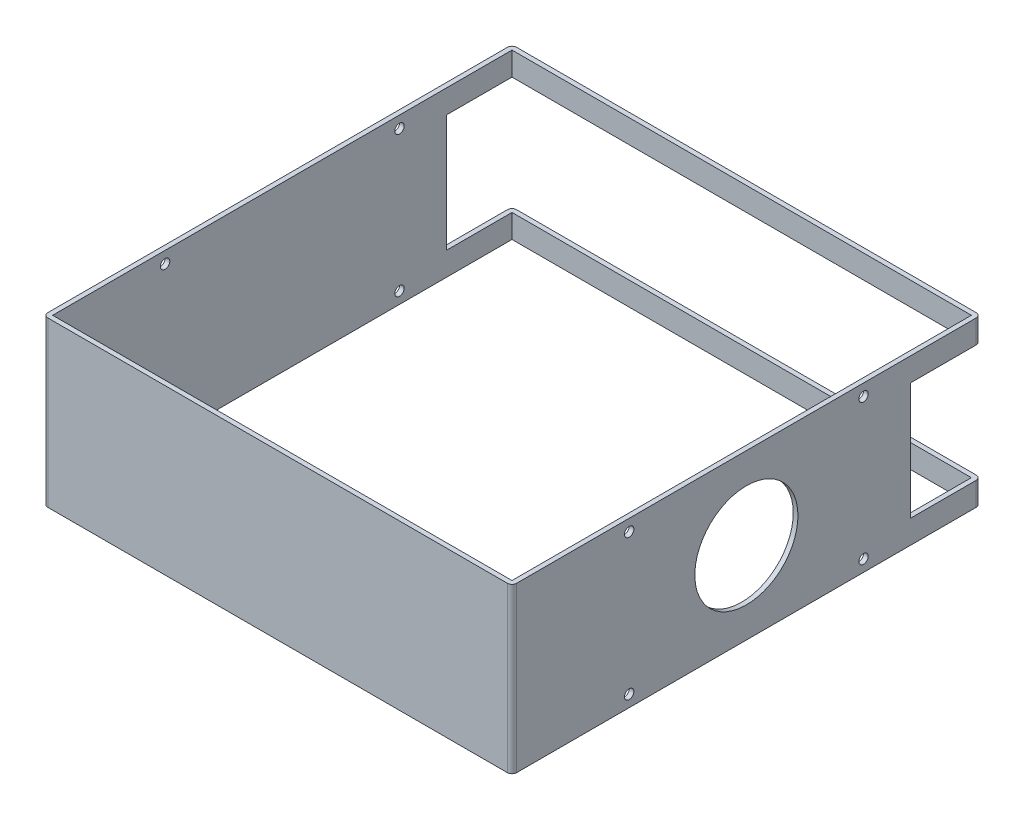
ISO-10303-21;
HEADER;
FILE_DESCRIPTION(('STEP AP214'),'2;1');
FILE_NAME('part.step','',(''),(''),'','','');
FILE_SCHEMA(('AUTOMOTIVE_DESIGN { 1 0 10303 214 1 1 1 1 }'));
ENDSEC;
DATA;
#1=APPLICATION_CONTEXT('core data for automotive mechanical design processes');
#2=APPLICATION_PROTOCOL_DEFINITION('international standard','automotive_design',2000,#1);
#3=PRODUCT_CONTEXT('',#1,'mechanical');
#4=PRODUCT('Part','Part','',(#3));
#5=PRODUCT_RELATED_PRODUCT_CATEGORY('part','',(#4));
#6=PRODUCT_DEFINITION_FORMATION('','',#4);
#7=PRODUCT_DEFINITION_CONTEXT('part definition',#1,'design');
#8=PRODUCT_DEFINITION('design','',#6,#7);
#9=PRODUCT_DEFINITION_SHAPE('','',#8);
#10=(LENGTH_UNIT() NAMED_UNIT(*) SI_UNIT(.MILLI.,.METRE.));
#11=(NAMED_UNIT(*) PLANE_ANGLE_UNIT() SI_UNIT($,.RADIAN.));
#12=(NAMED_UNIT(*) SI_UNIT($,.STERADIAN.) SOLID_ANGLE_UNIT());
#13=UNCERTAINTY_MEASURE_WITH_UNIT(LENGTH_MEASURE(1.E-05),#10,'distance_accuracy_value','');
#14=(GEOMETRIC_REPRESENTATION_CONTEXT(3) GLOBAL_UNCERTAINTY_ASSIGNED_CONTEXT((#13)) GLOBAL_UNIT_ASSIGNED_CONTEXT((#10,
#11,#12)) REPRESENTATION_CONTEXT('',''));
#15=CARTESIAN_POINT('',(0.,0.,0.));
#16=DIRECTION('',(0.,0.,1.));
#17=DIRECTION('',(1.,0.,0.));
#18=AXIS2_PLACEMENT_3D('',#15,#16,#17);
#19=CARTESIAN_POINT('',(50.,35.,-50.));
#20=DIRECTION('',(-1.,0.,0.));
#21=DIRECTION('',(0.,0.,1.));
#22=AXIS2_PLACEMENT_3D('',#19,#20,#21);
#23=PLANE('',#22);
#24=CARTESIAN_POINT('',(50.,17.5,0.));
#25=DIRECTION('',(1.,0.,0.));
#26=DIRECTION('',(0.,0.,-1.));
#27=AXIS2_PLACEMENT_3D('',#24,#25,#26);
#28=CIRCLE('',#27,11.);
#29=CARTESIAN_POINT('',(50.,17.5,-11.));
#30=VERTEX_POINT('',#29);
#31=EDGE_CURVE('E361',#30,#30,#28,.T.);
#32=ORIENTED_EDGE('',*,*,#31,.F.);
#33=EDGE_LOOP('',(#32));
#34=FACE_BOUND('',#33,.T.);
#35=CARTESIAN_POINT('',(50.,2.50000000000002,25.));
#36=DIRECTION('',(-1.,0.,0.));
#37=DIRECTION('',(0.,0.,1.));
#38=AXIS2_PLACEMENT_3D('',#35,#36,#37);
#39=CIRCLE('',#38,1.);
#40=CARTESIAN_POINT('',(50.,2.50000000000002,26.));
#41=VERTEX_POINT('',#40);
#42=EDGE_CURVE('E349',#41,#41,#39,.T.);
#43=ORIENTED_EDGE('',*,*,#42,.T.);
#44=EDGE_LOOP('',(#43));
#45=FACE_BOUND('',#44,.T.);
#46=CARTESIAN_POINT('',(50.,32.5,-25.));
#47=DIRECTION('',(-1.,0.,0.));
#48=DIRECTION('',(0.,0.,1.));
#49=AXIS2_PLACEMENT_3D('',#46,#47,#48);
#50=CIRCLE('',#49,1.);
#51=CARTESIAN_POINT('',(50.,32.5,-24.));
#52=VERTEX_POINT('',#51);
#53=EDGE_CURVE('E343',#52,#52,#50,.T.);
#54=ORIENTED_EDGE('',*,*,#53,.T.);
#55=EDGE_LOOP('',(#54));
#56=FACE_BOUND('',#55,.T.);
#57=DIRECTION('',(0.,0.,-1.));
#58=VECTOR('',#57,1.);
#59=CARTESIAN_POINT('',(50.,0.,-50.));
#60=LINE('',#59,#58);
#61=CARTESIAN_POINT('',(50.,0.,49.));
#62=VERTEX_POINT('',#61);
#63=CARTESIAN_POINT('',(50.,0.,-49.));
#64=VERTEX_POINT('',#63);
#65=EDGE_CURVE('E279',#62,#64,#60,.T.);
#66=ORIENTED_EDGE('',*,*,#65,.T.);
#67=DIRECTION('',(0.,-1.,0.));
#68=VECTOR('',#67,1.);
#69=CARTESIAN_POINT('',(50.,35.,-49.));
#70=LINE('',#69,#68);
#71=CARTESIAN_POINT('',(50.,5.,-49.));
#72=VERTEX_POINT('',#71);
#73=EDGE_CURVE('E11',#64,#72,#70,.F.);
#74=ORIENTED_EDGE('',*,*,#73,.T.);
#75=DIRECTION('',(0.,0.,-1.));
#76=VECTOR('',#75,1.);
#77=CARTESIAN_POINT('',(50.,5.,-35.));
#78=LINE('',#77,#76);
#79=CARTESIAN_POINT('',(50.,5.,-35.));
#80=VERTEX_POINT('',#79);
#81=EDGE_CURVE('E194',#80,#72,#78,.T.);
#82=ORIENTED_EDGE('',*,*,#81,.F.);
#83=DIRECTION('',(0.,-1.,0.));
#84=VECTOR('',#83,1.);
#85=CARTESIAN_POINT('',(50.,0.,-35.));
#86=LINE('',#85,#84);
#87=CARTESIAN_POINT('',(50.,30.,-35.));
#88=VERTEX_POINT('',#87);
#89=EDGE_CURVE('E206',#88,#80,#86,.T.);
#90=ORIENTED_EDGE('',*,*,#89,.F.);
#91=DIRECTION('',(0.,0.,-1.));
#92=VECTOR('',#91,1.);
#93=CARTESIAN_POINT('',(50.,30.,-35.));
#94=LINE('',#93,#92);
#95=CARTESIAN_POINT('',(50.,30.,-49.));
#96=VERTEX_POINT('',#95);
#97=EDGE_CURVE('E231',#88,#96,#94,.T.);
#98=ORIENTED_EDGE('',*,*,#97,.T.);
#99=DIRECTION('',(0.,-1.,0.));
#100=VECTOR('',#99,1.);
#101=CARTESIAN_POINT('',(50.,35.,-49.));
#102=LINE('',#101,#100);
#103=CARTESIAN_POINT('',(50.,35.,-49.));
#104=VERTEX_POINT('',#103);
#105=EDGE_CURVE('E49',#96,#104,#102,.F.);
#106=ORIENTED_EDGE('',*,*,#105,.T.);
#107=DIRECTION('',(0.,0.,-1.));
#108=VECTOR('',#107,1.);
#109=CARTESIAN_POINT('',(50.,35.,-50.));
#110=LINE('',#109,#108);
#111=CARTESIAN_POINT('',(50.,35.,49.));
#112=VERTEX_POINT('',#111);
#113=EDGE_CURVE('E292',#112,#104,#110,.T.);
#114=ORIENTED_EDGE('',*,*,#113,.F.);
#115=DIRECTION('',(0.,-1.,0.));
#116=VECTOR('',#115,1.);
#117=CARTESIAN_POINT('',(50.,35.,49.));
#118=LINE('',#117,#116);
#119=EDGE_CURVE('E428',#112,#62,#118,.T.);
#120=ORIENTED_EDGE('',*,*,#119,.T.);
#121=EDGE_LOOP('',(#66,#74,#82,#90,#98,#106,#114,#120));
#122=FACE_BOUND('',#121,.T.);
#123=CARTESIAN_POINT('',(50.,2.50000000000002,-25.));
#124=DIRECTION('',(-1.,0.,0.));
#125=DIRECTION('',(0.,0.,1.));
#126=AXIS2_PLACEMENT_3D('',#123,#124,#125);
#127=CIRCLE('',#126,1.);
#128=CARTESIAN_POINT('',(50.,2.50000000000002,-24.));
#129=VERTEX_POINT('',#128);
#130=EDGE_CURVE('E355',#129,#129,#127,.F.);
#131=ORIENTED_EDGE('',*,*,#130,.F.);
#132=EDGE_LOOP('',(#131));
#133=FACE_BOUND('',#132,.T.);
#134=CARTESIAN_POINT('',(50.,32.5,25.));
#135=DIRECTION('',(-1.,0.,0.));
#136=DIRECTION('',(0.,0.,1.));
#137=AXIS2_PLACEMENT_3D('',#134,#135,#136);
#138=CIRCLE('',#137,1.);
#139=CARTESIAN_POINT('',(50.,32.5,26.));
#140=VERTEX_POINT('',#139);
#141=EDGE_CURVE('E455',#140,#140,#138,.F.);
#142=ORIENTED_EDGE('',*,*,#141,.F.);
#143=EDGE_LOOP('',(#142));
#144=FACE_BOUND('',#143,.T.);
#145=ADVANCED_FACE('F40',(#34,#45,#56,#122,#133,#144),#23,.F.);
#146=CARTESIAN_POINT('',(-50.,35.,-50.));
#147=DIRECTION('',(1.,0.,0.));
#148=DIRECTION('',(0.,0.,-1.));
#149=AXIS2_PLACEMENT_3D('',#146,#147,#148);
#150=PLANE('',#149);
#151=CARTESIAN_POINT('',(-50.,2.50000000000002,25.));
#152=DIRECTION('',(-1.,0.,0.));
#153=DIRECTION('',(0.,0.,1.));
#154=AXIS2_PLACEMENT_3D('',#151,#152,#153);
#155=CIRCLE('',#154,1.);
#156=CARTESIAN_POINT('',(-50.,2.50000000000002,26.));
#157=VERTEX_POINT('',#156);
#158=EDGE_CURVE('E360',#157,#157,#155,.T.);
#159=ORIENTED_EDGE('',*,*,#158,.F.);
#160=EDGE_LOOP('',(#159));
#161=FACE_BOUND('',#160,.T.);
#162=CARTESIAN_POINT('',(-50.,32.5,-25.));
#163=DIRECTION('',(-1.,0.,0.));
#164=DIRECTION('',(0.,0.,1.));
#165=AXIS2_PLACEMENT_3D('',#162,#163,#164);
#166=CIRCLE('',#165,1.);
#167=CARTESIAN_POINT('',(-50.,32.5,-24.));
#168=VERTEX_POINT('',#167);
#169=EDGE_CURVE('E337',#168,#168,#166,.T.);
#170=ORIENTED_EDGE('',*,*,#169,.F.);
#171=EDGE_LOOP('',(#170));
#172=FACE_BOUND('',#171,.T.);
#173=DIRECTION('',(0.,0.,1.));
#174=VECTOR('',#173,1.);
#175=CARTESIAN_POINT('',(-50.,0.,-50.));
#176=LINE('',#175,#174);
#177=CARTESIAN_POINT('',(-50.,0.,-49.));
#178=VERTEX_POINT('',#177);
#179=CARTESIAN_POINT('',(-50.,0.,49.));
#180=VERTEX_POINT('',#179);
#181=EDGE_CURVE('E315',#178,#180,#176,.T.);
#182=ORIENTED_EDGE('',*,*,#181,.T.);
#183=DIRECTION('',(0.,-1.,0.));
#184=VECTOR('',#183,1.);
#185=CARTESIAN_POINT('',(-50.,35.,49.));
#186=LINE('',#185,#184);
#187=CARTESIAN_POINT('',(-50.,35.,49.));
#188=VERTEX_POINT('',#187);
#189=EDGE_CURVE('E388',#180,#188,#186,.F.);
#190=ORIENTED_EDGE('',*,*,#189,.T.);
#191=DIRECTION('',(0.,0.,1.));
#192=VECTOR('',#191,1.);
#193=CARTESIAN_POINT('',(-50.,35.,-50.));
#194=LINE('',#193,#192);
#195=CARTESIAN_POINT('',(-50.,35.,-49.));
#196=VERTEX_POINT('',#195);
#197=EDGE_CURVE('E301',#196,#188,#194,.T.);
#198=ORIENTED_EDGE('',*,*,#197,.F.);
#199=DIRECTION('',(0.,-1.,0.));
#200=VECTOR('',#199,1.);
#201=CARTESIAN_POINT('',(-50.,35.,-49.));
#202=LINE('',#201,#200);
#203=CARTESIAN_POINT('',(-50.,30.,-49.));
#204=VERTEX_POINT('',#203);
#205=EDGE_CURVE('E384',#196,#204,#202,.T.);
#206=ORIENTED_EDGE('',*,*,#205,.T.);
#207=DIRECTION('',(0.,0.,-1.));
#208=VECTOR('',#207,1.);
#209=CARTESIAN_POINT('',(-50.,30.,-35.));
#210=LINE('',#209,#208);
#211=CARTESIAN_POINT('',(-50.,30.,-35.));
#212=VERTEX_POINT('',#211);
#213=EDGE_CURVE('E221',#212,#204,#210,.T.);
#214=ORIENTED_EDGE('',*,*,#213,.F.);
#215=DIRECTION('',(0.,-1.,0.));
#216=VECTOR('',#215,1.);
#217=CARTESIAN_POINT('',(-50.,0.,-35.));
#218=LINE('',#217,#216);
#219=CARTESIAN_POINT('',(-50.,5.,-35.));
#220=VERTEX_POINT('',#219);
#221=EDGE_CURVE('E201',#212,#220,#218,.T.);
#222=ORIENTED_EDGE('',*,*,#221,.T.);
#223=DIRECTION('',(0.,0.,-1.));
#224=VECTOR('',#223,1.);
#225=CARTESIAN_POINT('',(-50.,5.,-35.));
#226=LINE('',#225,#224);
#227=CARTESIAN_POINT('',(-50.,5.,-49.));
#228=VERTEX_POINT('',#227);
#229=EDGE_CURVE('E216',#220,#228,#226,.T.);
#230=ORIENTED_EDGE('',*,*,#229,.T.);
#231=DIRECTION('',(0.,-1.,0.));
#232=VECTOR('',#231,1.);
#233=CARTESIAN_POINT('',(-50.,35.,-49.));
#234=LINE('',#233,#232);
#235=EDGE_CURVE('E380',#228,#178,#234,.T.);
#236=ORIENTED_EDGE('',*,*,#235,.T.);
#237=EDGE_LOOP('',(#182,#190,#198,#206,#214,#222,#230,#236));
#238=FACE_BOUND('',#237,.T.);
#239=CARTESIAN_POINT('',(-50.,2.50000000000002,-25.));
#240=DIRECTION('',(-1.,0.,0.));
#241=DIRECTION('',(0.,0.,1.));
#242=AXIS2_PLACEMENT_3D('',#239,#240,#241);
#243=CIRCLE('',#242,1.);
#244=CARTESIAN_POINT('',(-50.,2.50000000000002,-24.));
#245=VERTEX_POINT('',#244);
#246=EDGE_CURVE('E534',#245,#245,#243,.F.);
#247=ORIENTED_EDGE('',*,*,#246,.T.);
#248=EDGE_LOOP('',(#247));
#249=FACE_BOUND('',#248,.T.);
#250=CARTESIAN_POINT('',(-50.,32.5,25.));
#251=DIRECTION('',(-1.,0.,0.));
#252=DIRECTION('',(0.,0.,1.));
#253=AXIS2_PLACEMENT_3D('',#250,#251,#252);
#254=CIRCLE('',#253,1.);
#255=CARTESIAN_POINT('',(-50.,32.5,26.));
#256=VERTEX_POINT('',#255);
#257=EDGE_CURVE('E533',#256,#256,#254,.F.);
#258=ORIENTED_EDGE('',*,*,#257,.T.);
#259=EDGE_LOOP('',(#258));
#260=FACE_BOUND('',#259,.T.);
#261=ADVANCED_FACE('F465',(#161,#172,#238,#249,#260),#150,.F.);
#262=CARTESIAN_POINT('',(49.,0.,-49.));
#263=DIRECTION('',(1.,0.,0.));
#264=DIRECTION('',(0.,0.,-1.));
#265=AXIS2_PLACEMENT_3D('',#262,#263,#264);
#266=PLANE('',#265);
#267=CARTESIAN_POINT('',(49.,17.5,0.));
#268=DIRECTION('',(1.,0.,0.));
#269=DIRECTION('',(0.,0.,-1.));
#270=AXIS2_PLACEMENT_3D('',#267,#268,#269);
#271=CIRCLE('',#270,11.);
#272=CARTESIAN_POINT('',(49.,17.5,-11.));
#273=VERTEX_POINT('',#272);
#274=EDGE_CURVE('E356',#273,#273,#271,.T.);
#275=ORIENTED_EDGE('',*,*,#274,.T.);
#276=EDGE_LOOP('',(#275));
#277=FACE_BOUND('',#276,.T.);
#278=CARTESIAN_POINT('',(49.,2.50000000000002,25.));
#279=DIRECTION('',(1.,0.,0.));
#280=DIRECTION('',(0.,0.,-1.));
#281=AXIS2_PLACEMENT_3D('',#278,#279,#280);
#282=CIRCLE('',#281,1.);
#283=CARTESIAN_POINT('',(49.,2.50000000000002,24.));
#284=VERTEX_POINT('',#283);
#285=EDGE_CURVE('E342',#284,#284,#282,.T.);
#286=ORIENTED_EDGE('',*,*,#285,.T.);
#287=EDGE_LOOP('',(#286));
#288=FACE_BOUND('',#287,.T.);
#289=CARTESIAN_POINT('',(49.,32.5,-25.));
#290=DIRECTION('',(1.,0.,0.));
#291=DIRECTION('',(0.,0.,-1.));
#292=AXIS2_PLACEMENT_3D('',#289,#290,#291);
#293=CIRCLE('',#292,1.);
#294=CARTESIAN_POINT('',(49.,32.5,-26.));
#295=VERTEX_POINT('',#294);
#296=EDGE_CURVE('E336',#295,#295,#293,.T.);
#297=ORIENTED_EDGE('',*,*,#296,.T.);
#298=EDGE_LOOP('',(#297));
#299=FACE_BOUND('',#298,.T.);
#300=DIRECTION('',(0.,0.,-1.));
#301=VECTOR('',#300,1.);
#302=CARTESIAN_POINT('',(49.,30.,-49.));
#303=LINE('',#302,#301);
#304=CARTESIAN_POINT('',(49.,30.,-35.));
#305=VERTEX_POINT('',#304);
#306=CARTESIAN_POINT('',(49.,30.,-49.));
#307=VERTEX_POINT('',#306);
#308=EDGE_CURVE('E237',#305,#307,#303,.T.);
#309=ORIENTED_EDGE('',*,*,#308,.F.);
#310=DIRECTION('',(0.,1.,0.));
#311=VECTOR('',#310,1.);
#312=CARTESIAN_POINT('',(49.,0.,-35.));
#313=LINE('',#312,#311);
#314=CARTESIAN_POINT('',(49.,5.,-35.));
#315=VERTEX_POINT('',#314);
#316=EDGE_CURVE('E240',#315,#305,#313,.T.);
#317=ORIENTED_EDGE('',*,*,#316,.F.);
#318=DIRECTION('',(0.,0.,-1.));
#319=VECTOR('',#318,1.);
#320=CARTESIAN_POINT('',(49.,5.,-49.));
#321=LINE('',#320,#319);
#322=CARTESIAN_POINT('',(49.,5.,-49.));
#323=VERTEX_POINT('',#322);
#324=EDGE_CURVE('E197',#315,#323,#321,.T.);
#325=ORIENTED_EDGE('',*,*,#324,.T.);
#326=DIRECTION('',(0.,1.,0.));
#327=VECTOR('',#326,1.);
#328=CARTESIAN_POINT('',(49.,0.,-49.));
#329=LINE('',#328,#327);
#330=CARTESIAN_POINT('',(49.,0.,-49.));
#331=VERTEX_POINT('',#330);
#332=EDGE_CURVE('E288',#331,#323,#329,.T.);
#333=ORIENTED_EDGE('',*,*,#332,.F.);
#334=DIRECTION('',(0.,0.,-1.));
#335=VECTOR('',#334,1.);
#336=CARTESIAN_POINT('',(49.,0.,-49.));
#337=LINE('',#336,#335);
#338=CARTESIAN_POINT('',(49.,0.,49.));
#339=VERTEX_POINT('',#338);
#340=EDGE_CURVE('E244',#339,#331,#337,.T.);
#341=ORIENTED_EDGE('',*,*,#340,.F.);
#342=DIRECTION('',(0.,1.,0.));
#343=VECTOR('',#342,1.);
#344=CARTESIAN_POINT('',(49.,0.,49.));
#345=LINE('',#344,#343);
#346=CARTESIAN_POINT('',(49.,35.,49.));
#347=VERTEX_POINT('',#346);
#348=EDGE_CURVE('E276',#339,#347,#345,.T.);
#349=ORIENTED_EDGE('',*,*,#348,.T.);
#350=DIRECTION('',(0.,0.,-1.));
#351=VECTOR('',#350,1.);
#352=CARTESIAN_POINT('',(49.,35.,-49.));
#353=LINE('',#352,#351);
#354=CARTESIAN_POINT('',(49.,35.,-49.));
#355=VERTEX_POINT('',#354);
#356=EDGE_CURVE('E243',#347,#355,#353,.T.);
#357=ORIENTED_EDGE('',*,*,#356,.T.);
#358=EDGE_CURVE('E261',#307,#355,#329,.T.);
#359=ORIENTED_EDGE('',*,*,#358,.F.);
#360=EDGE_LOOP('',(#309,#317,#325,#333,#341,#349,#357,#359));
#361=FACE_BOUND('',#360,.T.);
#362=CARTESIAN_POINT('',(49.,2.50000000000002,-25.));
#363=DIRECTION('',(1.,0.,0.));
#364=DIRECTION('',(0.,0.,-1.));
#365=AXIS2_PLACEMENT_3D('',#362,#363,#364);
#366=CIRCLE('',#365,1.);
#367=CARTESIAN_POINT('',(49.,2.50000000000002,-26.));
#368=VERTEX_POINT('',#367);
#369=EDGE_CURVE('E348',#368,#368,#366,.F.);
#370=ORIENTED_EDGE('',*,*,#369,.F.);
#371=EDGE_LOOP('',(#370));
#372=FACE_BOUND('',#371,.T.);
#373=CARTESIAN_POINT('',(49.,32.5,25.));
#374=DIRECTION('',(1.,0.,0.));
#375=DIRECTION('',(0.,0.,-1.));
#376=AXIS2_PLACEMENT_3D('',#373,#374,#375);
#377=CIRCLE('',#376,1.);
#378=CARTESIAN_POINT('',(49.,32.5,24.));
#379=VERTEX_POINT('',#378);
#380=EDGE_CURVE('E354',#379,#379,#377,.F.);
#381=ORIENTED_EDGE('',*,*,#380,.F.);
#382=EDGE_LOOP('',(#381));
#383=FACE_BOUND('',#382,.T.);
#384=ADVANCED_FACE('F596',(#277,#288,#299,#361,#372,#383),#266,.F.);
#385=CARTESIAN_POINT('',(-49.,0.,-49.));
#386=DIRECTION('',(-1.,0.,0.));
#387=DIRECTION('',(0.,0.,1.));
#388=AXIS2_PLACEMENT_3D('',#385,#386,#387);
#389=PLANE('',#388);
#390=CARTESIAN_POINT('',(-49.,2.50000000000002,25.));
#391=DIRECTION('',(-1.,0.,0.));
#392=DIRECTION('',(0.,0.,1.));
#393=AXIS2_PLACEMENT_3D('',#390,#391,#392);
#394=CIRCLE('',#393,1.);
#395=CARTESIAN_POINT('',(-49.,2.50000000000002,26.));
#396=VERTEX_POINT('',#395);
#397=EDGE_CURVE('E338',#396,#396,#394,.T.);
#398=ORIENTED_EDGE('',*,*,#397,.T.);
#399=EDGE_LOOP('',(#398));
#400=FACE_BOUND('',#399,.T.);
#401=CARTESIAN_POINT('',(-49.,32.5,-25.));
#402=DIRECTION('',(-1.,0.,0.));
#403=DIRECTION('',(0.,0.,1.));
#404=AXIS2_PLACEMENT_3D('',#401,#402,#403);
#405=CIRCLE('',#404,1.);
#406=CARTESIAN_POINT('',(-49.,32.5,-24.));
#407=VERTEX_POINT('',#406);
#408=EDGE_CURVE('E332',#407,#407,#405,.T.);
#409=ORIENTED_EDGE('',*,*,#408,.T.);
#410=EDGE_LOOP('',(#409));
#411=FACE_BOUND('',#410,.T.);
#412=DIRECTION('',(0.,0.,1.));
#413=VECTOR('',#412,1.);
#414=CARTESIAN_POINT('',(-49.,30.,-49.));
#415=LINE('',#414,#413);
#416=CARTESIAN_POINT('',(-49.,30.,-49.));
#417=VERTEX_POINT('',#416);
#418=CARTESIAN_POINT('',(-49.,30.,-35.));
#419=VERTEX_POINT('',#418);
#420=EDGE_CURVE('E234',#417,#419,#415,.T.);
#421=ORIENTED_EDGE('',*,*,#420,.F.);
#422=DIRECTION('',(0.,1.,0.));
#423=VECTOR('',#422,1.);
#424=CARTESIAN_POINT('',(-49.,0.,-49.));
#425=LINE('',#424,#423);
#426=CARTESIAN_POINT('',(-49.,35.,-49.));
#427=VERTEX_POINT('',#426);
#428=EDGE_CURVE('E287',#417,#427,#425,.T.);
#429=ORIENTED_EDGE('',*,*,#428,.T.);
#430=DIRECTION('',(0.,0.,1.));
#431=VECTOR('',#430,1.);
#432=CARTESIAN_POINT('',(-49.,35.,-49.));
#433=LINE('',#432,#431);
#434=CARTESIAN_POINT('',(-49.,35.,49.));
#435=VERTEX_POINT('',#434);
#436=EDGE_CURVE('E269',#427,#435,#433,.T.);
#437=ORIENTED_EDGE('',*,*,#436,.T.);
#438=DIRECTION('',(0.,1.,0.));
#439=VECTOR('',#438,1.);
#440=CARTESIAN_POINT('',(-49.,0.,49.));
#441=LINE('',#440,#439);
#442=CARTESIAN_POINT('',(-49.,0.,49.));
#443=VERTEX_POINT('',#442);
#444=EDGE_CURVE('E280',#443,#435,#441,.T.);
#445=ORIENTED_EDGE('',*,*,#444,.F.);
#446=DIRECTION('',(0.,0.,1.));
#447=VECTOR('',#446,1.);
#448=CARTESIAN_POINT('',(-49.,0.,-49.));
#449=LINE('',#448,#447);
#450=CARTESIAN_POINT('',(-49.,0.,-49.));
#451=VERTEX_POINT('',#450);
#452=EDGE_CURVE('E253',#451,#443,#449,.T.);
#453=ORIENTED_EDGE('',*,*,#452,.F.);
#454=CARTESIAN_POINT('',(-49.,5.,-49.));
#455=VERTEX_POINT('',#454);
#456=EDGE_CURVE('E283',#451,#455,#425,.T.);
#457=ORIENTED_EDGE('',*,*,#456,.T.);
#458=DIRECTION('',(0.,0.,1.));
#459=VECTOR('',#458,1.);
#460=CARTESIAN_POINT('',(-49.,5.,-49.));
#461=LINE('',#460,#459);
#462=CARTESIAN_POINT('',(-49.,5.,-35.));
#463=VERTEX_POINT('',#462);
#464=EDGE_CURVE('E227',#455,#463,#461,.T.);
#465=ORIENTED_EDGE('',*,*,#464,.T.);
#466=DIRECTION('',(0.,-1.,0.));
#467=VECTOR('',#466,1.);
#468=CARTESIAN_POINT('',(-49.,0.,-35.));
#469=LINE('',#468,#467);
#470=EDGE_CURVE('E328',#419,#463,#469,.T.);
#471=ORIENTED_EDGE('',*,*,#470,.F.);
#472=EDGE_LOOP('',(#421,#429,#437,#445,#453,#457,#465,#471));
#473=FACE_BOUND('',#472,.T.);
#474=CARTESIAN_POINT('',(-49.,2.50000000000002,-25.));
#475=DIRECTION('',(-1.,0.,0.));
#476=DIRECTION('',(0.,0.,1.));
#477=AXIS2_PLACEMENT_3D('',#474,#475,#476);
#478=CIRCLE('',#477,1.);
#479=CARTESIAN_POINT('',(-49.,2.50000000000002,-24.));
#480=VERTEX_POINT('',#479);
#481=EDGE_CURVE('E344',#480,#480,#478,.F.);
#482=ORIENTED_EDGE('',*,*,#481,.F.);
#483=EDGE_LOOP('',(#482));
#484=FACE_BOUND('',#483,.T.);
#485=CARTESIAN_POINT('',(-49.,32.5,25.));
#486=DIRECTION('',(-1.,0.,0.));
#487=DIRECTION('',(0.,0.,1.));
#488=AXIS2_PLACEMENT_3D('',#485,#486,#487);
#489=CIRCLE('',#488,1.);
#490=CARTESIAN_POINT('',(-49.,32.5,26.));
#491=VERTEX_POINT('',#490);
#492=EDGE_CURVE('E350',#491,#491,#489,.F.);
#493=ORIENTED_EDGE('',*,*,#492,.F.);
#494=EDGE_LOOP('',(#493));
#495=FACE_BOUND('',#494,.T.);
#496=ADVANCED_FACE('F593',(#400,#411,#473,#484,#495),#389,.F.);
#497=CARTESIAN_POINT('',(-50.,35.,-50.));
#498=DIRECTION('',(0.,0.,1.));
#499=DIRECTION('',(1.,0.,0.));
#500=AXIS2_PLACEMENT_3D('',#497,#498,#499);
#501=PLANE('',#500);
#502=DIRECTION('',(-1.,0.,0.));
#503=VECTOR('',#502,1.);
#504=CARTESIAN_POINT('',(0.,30.,-50.));
#505=LINE('',#504,#503);
#506=CARTESIAN_POINT('',(49.,30.,-50.));
#507=VERTEX_POINT('',#506);
#508=CARTESIAN_POINT('',(-49.,30.,-50.));
#509=VERTEX_POINT('',#508);
#510=EDGE_CURVE('E212',#507,#509,#505,.T.);
#511=ORIENTED_EDGE('',*,*,#510,.T.);
#512=DIRECTION('',(0.,-1.,0.));
#513=VECTOR('',#512,1.);
#514=CARTESIAN_POINT('',(-49.,35.,-50.));
#515=LINE('',#514,#513);
#516=CARTESIAN_POINT('',(-49.,35.,-50.));
#517=VERTEX_POINT('',#516);
#518=EDGE_CURVE('E413',#509,#517,#515,.F.);
#519=ORIENTED_EDGE('',*,*,#518,.T.);
#520=DIRECTION('',(-1.,0.,0.));
#521=VECTOR('',#520,1.);
#522=CARTESIAN_POINT('',(-50.,35.,-50.));
#523=LINE('',#522,#521);
#524=CARTESIAN_POINT('',(49.,35.,-50.));
#525=VERTEX_POINT('',#524);
#526=EDGE_CURVE('E296',#525,#517,#523,.T.);
#527=ORIENTED_EDGE('',*,*,#526,.F.);
#528=DIRECTION('',(0.,-1.,0.));
#529=VECTOR('',#528,1.);
#530=CARTESIAN_POINT('',(49.,35.,-50.));
#531=LINE('',#530,#529);
#532=EDGE_CURVE('E409',#525,#507,#531,.T.);
#533=ORIENTED_EDGE('',*,*,#532,.T.);
#534=EDGE_LOOP('',(#511,#519,#527,#533));
#535=FACE_BOUND('',#534,.T.);
#536=ADVANCED_FACE('F446',(#535),#501,.F.);
#537=CARTESIAN_POINT('',(-49.,0.,-49.));
#538=DIRECTION('',(0.,0.,-1.));
#539=DIRECTION('',(-1.,0.,0.));
#540=AXIS2_PLACEMENT_3D('',#537,#538,#539);
#541=PLANE('',#540);
#542=DIRECTION('',(-1.,0.,0.));
#543=VECTOR('',#542,1.);
#544=CARTESIAN_POINT('',(-49.,30.,-49.));
#545=LINE('',#544,#543);
#546=EDGE_CURVE('E325',#307,#417,#545,.T.);
#547=ORIENTED_EDGE('',*,*,#546,.F.);
#548=ORIENTED_EDGE('',*,*,#358,.T.);
#549=DIRECTION('',(-1.,0.,0.));
#550=VECTOR('',#549,1.);
#551=CARTESIAN_POINT('',(-49.,35.,-49.));
#552=LINE('',#551,#550);
#553=EDGE_CURVE('E265',#355,#427,#552,.T.);
#554=ORIENTED_EDGE('',*,*,#553,.T.);
#555=ORIENTED_EDGE('',*,*,#428,.F.);
#556=EDGE_LOOP('',(#547,#548,#554,#555));
#557=FACE_BOUND('',#556,.T.);
#558=ADVANCED_FACE('F651',(#557),#541,.F.);
#559=DIRECTION('',(-1.,0.,0.));
#560=VECTOR('',#559,1.);
#561=CARTESIAN_POINT('',(-50.,0.,-50.));
#562=LINE('',#561,#560);
#563=CARTESIAN_POINT('',(49.,0.,-50.));
#564=VERTEX_POINT('',#563);
#565=CARTESIAN_POINT('',(-49.,0.,-50.));
#566=VERTEX_POINT('',#565);
#567=EDGE_CURVE('E312',#564,#566,#562,.T.);
#568=ORIENTED_EDGE('',*,*,#567,.T.);
#569=DIRECTION('',(0.,-1.,0.));
#570=VECTOR('',#569,1.);
#571=CARTESIAN_POINT('',(-49.,35.,-50.));
#572=LINE('',#571,#570);
#573=CARTESIAN_POINT('',(-49.,5.,-50.));
#574=VERTEX_POINT('',#573);
#575=EDGE_CURVE('E62',#566,#574,#572,.F.);
#576=ORIENTED_EDGE('',*,*,#575,.T.);
#577=DIRECTION('',(-1.,0.,0.));
#578=VECTOR('',#577,1.);
#579=CARTESIAN_POINT('',(0.,5.,-50.));
#580=LINE('',#579,#578);
#581=CARTESIAN_POINT('',(49.,5.,-50.));
#582=VERTEX_POINT('',#581);
#583=EDGE_CURVE('E452',#582,#574,#580,.T.);
#584=ORIENTED_EDGE('',*,*,#583,.F.);
#585=DIRECTION('',(0.,-1.,0.));
#586=VECTOR('',#585,1.);
#587=CARTESIAN_POINT('',(49.,35.,-50.));
#588=LINE('',#587,#586);
#589=EDGE_CURVE('E416',#582,#564,#588,.T.);
#590=ORIENTED_EDGE('',*,*,#589,.T.);
#591=EDGE_LOOP('',(#568,#576,#584,#590));
#592=FACE_BOUND('',#591,.T.);
#593=ADVANCED_FACE('F491',(#592),#501,.F.);
#594=CARTESIAN_POINT('',(-50.,35.,50.));
#595=DIRECTION('',(0.,0.,-1.));
#596=DIRECTION('',(-1.,0.,0.));
#597=AXIS2_PLACEMENT_3D('',#594,#595,#596);
#598=PLANE('',#597);
#599=DIRECTION('',(1.,0.,0.));
#600=VECTOR('',#599,1.);
#601=CARTESIAN_POINT('',(-50.,35.,50.));
#602=LINE('',#601,#600);
#603=CARTESIAN_POINT('',(-49.,35.,50.));
#604=VERTEX_POINT('',#603);
#605=CARTESIAN_POINT('',(49.,35.,50.));
#606=VERTEX_POINT('',#605);
#607=EDGE_CURVE('E305',#604,#606,#602,.T.);
#608=ORIENTED_EDGE('',*,*,#607,.F.);
#609=DIRECTION('',(0.,-1.,0.));
#610=VECTOR('',#609,1.);
#611=CARTESIAN_POINT('',(-49.,35.,50.));
#612=LINE('',#611,#610);
#613=CARTESIAN_POINT('',(-49.,0.,50.));
#614=VERTEX_POINT('',#613);
#615=EDGE_CURVE('E364',#604,#614,#612,.T.);
#616=ORIENTED_EDGE('',*,*,#615,.T.);
#617=DIRECTION('',(1.,0.,0.));
#618=VECTOR('',#617,1.);
#619=CARTESIAN_POINT('',(-50.,0.,50.));
#620=LINE('',#619,#618);
#621=CARTESIAN_POINT('',(49.,0.,50.));
#622=VERTEX_POINT('',#621);
#623=EDGE_CURVE('E297',#614,#622,#620,.T.);
#624=ORIENTED_EDGE('',*,*,#623,.T.);
#625=DIRECTION('',(0.,-1.,0.));
#626=VECTOR('',#625,1.);
#627=CARTESIAN_POINT('',(49.,35.,50.));
#628=LINE('',#627,#626);
#629=EDGE_CURVE('E331',#622,#606,#628,.F.);
#630=ORIENTED_EDGE('',*,*,#629,.T.);
#631=EDGE_LOOP('',(#608,#616,#624,#630));
#632=FACE_BOUND('',#631,.T.);
#633=ADVANCED_FACE('F480',(#632),#598,.F.);
#634=CARTESIAN_POINT('',(0.,35.,0.));
#635=DIRECTION('',(0.,1.,0.));
#636=DIRECTION('',(0.,0.,1.));
#637=AXIS2_PLACEMENT_3D('',#634,#635,#636);
#638=PLANE('',#637);
#639=ORIENTED_EDGE('',*,*,#356,.F.);
#640=DIRECTION('',(1.,0.,0.));
#641=VECTOR('',#640,1.);
#642=CARTESIAN_POINT('',(-49.,35.,49.));
#643=LINE('',#642,#641);
#644=EDGE_CURVE('E249',#435,#347,#643,.T.);
#645=ORIENTED_EDGE('',*,*,#644,.F.);
#646=ORIENTED_EDGE('',*,*,#436,.F.);
#647=ORIENTED_EDGE('',*,*,#553,.F.);
#648=EDGE_LOOP('',(#639,#645,#646,#647));
#649=FACE_BOUND('',#648,.T.);
#650=ORIENTED_EDGE('',*,*,#197,.T.);
#651=CARTESIAN_POINT('',(-49.,35.,49.));
#652=DIRECTION('',(0.,1.,0.));
#653=DIRECTION('',(0.,0.,1.));
#654=AXIS2_PLACEMENT_3D('',#651,#652,#653);
#655=CIRCLE('',#654,1.);
#656=EDGE_CURVE('E400',#188,#604,#655,.T.);
#657=ORIENTED_EDGE('',*,*,#656,.T.);
#658=ORIENTED_EDGE('',*,*,#607,.T.);
#659=CARTESIAN_POINT('',(49.,35.,49.));
#660=DIRECTION('',(0.,1.,0.));
#661=DIRECTION('',(0.,0.,1.));
#662=AXIS2_PLACEMENT_3D('',#659,#660,#661);
#663=CIRCLE('',#662,1.);
#664=EDGE_CURVE('E391',#606,#112,#663,.T.);
#665=ORIENTED_EDGE('',*,*,#664,.T.);
#666=ORIENTED_EDGE('',*,*,#113,.T.);
#667=CARTESIAN_POINT('',(49.,35.,-49.));
#668=DIRECTION('',(0.,1.,0.));
#669=DIRECTION('',(0.,0.,1.));
#670=AXIS2_PLACEMENT_3D('',#667,#668,#669);
#671=CIRCLE('',#670,1.);
#672=EDGE_CURVE('E394',#104,#525,#671,.T.);
#673=ORIENTED_EDGE('',*,*,#672,.T.);
#674=ORIENTED_EDGE('',*,*,#526,.T.);
#675=CARTESIAN_POINT('',(-49.,35.,-49.));
#676=DIRECTION('',(0.,1.,0.));
#677=DIRECTION('',(0.,0.,1.));
#678=AXIS2_PLACEMENT_3D('',#675,#676,#677);
#679=CIRCLE('',#678,1.);
#680=EDGE_CURVE('E397',#517,#196,#679,.T.);
#681=ORIENTED_EDGE('',*,*,#680,.T.);
#682=EDGE_LOOP('',(#650,#657,#658,#665,#666,#673,#674,#681));
#683=FACE_BOUND('',#682,.T.);
#684=ADVANCED_FACE('F438',(#649,#683),#638,.T.);
#685=CARTESIAN_POINT('',(0.,0.,0.));
#686=DIRECTION('',(0.,1.,0.));
#687=DIRECTION('',(0.,0.,1.));
#688=AXIS2_PLACEMENT_3D('',#685,#686,#687);
#689=PLANE('',#688);
#690=DIRECTION('',(1.,0.,0.));
#691=VECTOR('',#690,1.);
#692=CARTESIAN_POINT('',(-49.,0.,49.));
#693=LINE('',#692,#691);
#694=EDGE_CURVE('E257',#443,#339,#693,.T.);
#695=ORIENTED_EDGE('',*,*,#694,.T.);
#696=ORIENTED_EDGE('',*,*,#340,.T.);
#697=DIRECTION('',(-1.,0.,0.));
#698=VECTOR('',#697,1.);
#699=CARTESIAN_POINT('',(-49.,0.,-49.));
#700=LINE('',#699,#698);
#701=EDGE_CURVE('E248',#331,#451,#700,.T.);
#702=ORIENTED_EDGE('',*,*,#701,.T.);
#703=ORIENTED_EDGE('',*,*,#452,.T.);
#704=EDGE_LOOP('',(#695,#696,#702,#703));
#705=FACE_BOUND('',#704,.T.);
#706=ORIENTED_EDGE('',*,*,#623,.F.);
#707=CARTESIAN_POINT('',(-49.,0.,49.));
#708=DIRECTION('',(0.,1.,0.));
#709=DIRECTION('',(0.,0.,1.));
#710=AXIS2_PLACEMENT_3D('',#707,#708,#709);
#711=CIRCLE('',#710,1.);
#712=EDGE_CURVE('E377',#614,#180,#711,.F.);
#713=ORIENTED_EDGE('',*,*,#712,.T.);
#714=ORIENTED_EDGE('',*,*,#181,.F.);
#715=CARTESIAN_POINT('',(-49.,0.,-49.));
#716=DIRECTION('',(0.,1.,0.));
#717=DIRECTION('',(0.,0.,1.));
#718=AXIS2_PLACEMENT_3D('',#715,#716,#717);
#719=CIRCLE('',#718,1.);
#720=EDGE_CURVE('E374',#178,#566,#719,.F.);
#721=ORIENTED_EDGE('',*,*,#720,.T.);
#722=ORIENTED_EDGE('',*,*,#567,.F.);
#723=CARTESIAN_POINT('',(49.,0.,-49.));
#724=DIRECTION('',(0.,1.,0.));
#725=DIRECTION('',(0.,0.,1.));
#726=AXIS2_PLACEMENT_3D('',#723,#724,#725);
#727=CIRCLE('',#726,1.);
#728=EDGE_CURVE('E371',#564,#64,#727,.F.);
#729=ORIENTED_EDGE('',*,*,#728,.T.);
#730=ORIENTED_EDGE('',*,*,#65,.F.);
#731=CARTESIAN_POINT('',(49.,0.,49.));
#732=DIRECTION('',(0.,1.,0.));
#733=DIRECTION('',(0.,0.,1.));
#734=AXIS2_PLACEMENT_3D('',#731,#732,#733);
#735=CIRCLE('',#734,1.);
#736=EDGE_CURVE('E368',#62,#622,#735,.F.);
#737=ORIENTED_EDGE('',*,*,#736,.T.);
#738=EDGE_LOOP('',(#706,#713,#714,#721,#722,#729,#730,#737));
#739=FACE_BOUND('',#738,.T.);
#740=ADVANCED_FACE('F483',(#705,#739),#689,.F.);
#741=CARTESIAN_POINT('',(-49.,0.,49.));
#742=DIRECTION('',(0.,0.,1.));
#743=DIRECTION('',(1.,0.,0.));
#744=AXIS2_PLACEMENT_3D('',#741,#742,#743);
#745=PLANE('',#744);
#746=ORIENTED_EDGE('',*,*,#644,.T.);
#747=ORIENTED_EDGE('',*,*,#348,.F.);
#748=ORIENTED_EDGE('',*,*,#694,.F.);
#749=ORIENTED_EDGE('',*,*,#444,.T.);
#750=EDGE_LOOP('',(#746,#747,#748,#749));
#751=FACE_BOUND('',#750,.T.);
#752=ADVANCED_FACE('F646',(#751),#745,.F.);
#753=ORIENTED_EDGE('',*,*,#332,.T.);
#754=DIRECTION('',(-1.,0.,0.));
#755=VECTOR('',#754,1.);
#756=CARTESIAN_POINT('',(-49.,5.,-49.));
#757=LINE('',#756,#755);
#758=EDGE_CURVE('E309',#323,#455,#757,.T.);
#759=ORIENTED_EDGE('',*,*,#758,.T.);
#760=ORIENTED_EDGE('',*,*,#456,.F.);
#761=ORIENTED_EDGE('',*,*,#701,.F.);
#762=EDGE_LOOP('',(#753,#759,#760,#761));
#763=FACE_BOUND('',#762,.T.);
#764=ADVANCED_FACE('F640',(#763),#541,.F.);
#765=CARTESIAN_POINT('',(0.,0.,-35.));
#766=DIRECTION('',(0.,0.,-1.));
#767=DIRECTION('',(-1.,0.,0.));
#768=AXIS2_PLACEMENT_3D('',#765,#766,#767);
#769=PLANE('',#768);
#770=ORIENTED_EDGE('',*,*,#316,.T.);
#771=DIRECTION('',(-1.,0.,0.));
#772=VECTOR('',#771,1.);
#773=CARTESIAN_POINT('',(0.,30.,-35.));
#774=LINE('',#773,#772);
#775=EDGE_CURVE('E209',#88,#305,#774,.T.);
#776=ORIENTED_EDGE('',*,*,#775,.F.);
#777=ORIENTED_EDGE('',*,*,#89,.T.);
#778=DIRECTION('',(-1.,0.,0.));
#779=VECTOR('',#778,1.);
#780=CARTESIAN_POINT('',(0.,5.,-35.));
#781=LINE('',#780,#779);
#782=EDGE_CURVE('E191',#80,#315,#781,.T.);
#783=ORIENTED_EDGE('',*,*,#782,.T.);
#784=EDGE_LOOP('',(#770,#776,#777,#783));
#785=FACE_BOUND('',#784,.T.);
#786=ADVANCED_FACE('F207',(#785),#769,.T.);
#787=ORIENTED_EDGE('',*,*,#470,.T.);
#788=EDGE_CURVE('E202',#463,#220,#781,.T.);
#789=ORIENTED_EDGE('',*,*,#788,.T.);
#790=ORIENTED_EDGE('',*,*,#221,.F.);
#791=EDGE_CURVE('E223',#419,#212,#774,.T.);
#792=ORIENTED_EDGE('',*,*,#791,.F.);
#793=EDGE_LOOP('',(#787,#789,#790,#792));
#794=FACE_BOUND('',#793,.T.);
#795=ADVANCED_FACE('F499',(#794),#769,.T.);
#796=CARTESIAN_POINT('',(0.,30.,-35.));
#797=DIRECTION('',(0.,-1.,0.));
#798=DIRECTION('',(0.,0.,-1.));
#799=AXIS2_PLACEMENT_3D('',#796,#797,#798);
#800=PLANE('',#799);
#801=ORIENTED_EDGE('',*,*,#213,.T.);
#802=CARTESIAN_POINT('',(-49.,30.,-49.));
#803=DIRECTION('',(0.,-1.,0.));
#804=DIRECTION('',(0.,0.,-1.));
#805=AXIS2_PLACEMENT_3D('',#802,#803,#804);
#806=CIRCLE('',#805,1.);
#807=EDGE_CURVE('E406',#204,#509,#806,.T.);
#808=ORIENTED_EDGE('',*,*,#807,.T.);
#809=ORIENTED_EDGE('',*,*,#510,.F.);
#810=CARTESIAN_POINT('',(49.,30.,-49.));
#811=DIRECTION('',(0.,-1.,0.));
#812=DIRECTION('',(0.,0.,-1.));
#813=AXIS2_PLACEMENT_3D('',#810,#811,#812);
#814=CIRCLE('',#813,1.);
#815=EDGE_CURVE('E403',#507,#96,#814,.T.);
#816=ORIENTED_EDGE('',*,*,#815,.T.);
#817=ORIENTED_EDGE('',*,*,#97,.F.);
#818=ORIENTED_EDGE('',*,*,#775,.T.);
#819=ORIENTED_EDGE('',*,*,#308,.T.);
#820=ORIENTED_EDGE('',*,*,#546,.T.);
#821=ORIENTED_EDGE('',*,*,#420,.T.);
#822=ORIENTED_EDGE('',*,*,#791,.T.);
#823=EDGE_LOOP('',(#801,#808,#809,#816,#817,#818,#819,#820,#821,#822));
#824=FACE_BOUND('',#823,.T.);
#825=ADVANCED_FACE('F450',(#824),#800,.T.);
#826=CARTESIAN_POINT('',(0.,5.,-35.));
#827=DIRECTION('',(0.,-1.,0.));
#828=DIRECTION('',(0.,0.,-1.));
#829=AXIS2_PLACEMENT_3D('',#826,#827,#828);
#830=PLANE('',#829);
#831=ORIENTED_EDGE('',*,*,#583,.T.);
#832=CARTESIAN_POINT('',(-49.,5.,-49.));
#833=DIRECTION('',(0.,-1.,0.));
#834=DIRECTION('',(0.,0.,-1.));
#835=AXIS2_PLACEMENT_3D('',#832,#833,#834);
#836=CIRCLE('',#835,1.);
#837=EDGE_CURVE('E425',#574,#228,#836,.F.);
#838=ORIENTED_EDGE('',*,*,#837,.T.);
#839=ORIENTED_EDGE('',*,*,#229,.F.);
#840=ORIENTED_EDGE('',*,*,#788,.F.);
#841=ORIENTED_EDGE('',*,*,#464,.F.);
#842=ORIENTED_EDGE('',*,*,#758,.F.);
#843=ORIENTED_EDGE('',*,*,#324,.F.);
#844=ORIENTED_EDGE('',*,*,#782,.F.);
#845=ORIENTED_EDGE('',*,*,#81,.T.);
#846=CARTESIAN_POINT('',(49.,5.,-49.));
#847=DIRECTION('',(0.,-1.,0.));
#848=DIRECTION('',(0.,0.,-1.));
#849=AXIS2_PLACEMENT_3D('',#846,#847,#848);
#850=CIRCLE('',#849,1.);
#851=EDGE_CURVE('E422',#72,#582,#850,.F.);
#852=ORIENTED_EDGE('',*,*,#851,.T.);
#853=EDGE_LOOP('',(#831,#838,#839,#840,#841,#842,#843,#844,#845,#852));
#854=FACE_BOUND('',#853,.T.);
#855=ADVANCED_FACE('F193',(#854),#830,.F.);
#856=CARTESIAN_POINT('',(64.,32.5,-25.));
#857=DIRECTION('',(-1.,0.,0.));
#858=DIRECTION('',(0.,0.,1.));
#859=AXIS2_PLACEMENT_3D('',#856,#857,#858);
#860=CYLINDRICAL_SURFACE('',#859,1.);
#861=ORIENTED_EDGE('',*,*,#169,.T.);
#862=EDGE_LOOP('',(#861));
#863=FACE_BOUND('',#862,.T.);
#864=ORIENTED_EDGE('',*,*,#408,.F.);
#865=EDGE_LOOP('',(#864));
#866=FACE_BOUND('',#865,.T.);
#867=ADVANCED_FACE('F564',(#863,#866),#860,.F.);
#868=CARTESIAN_POINT('',(64.,2.50000000000002,25.));
#869=DIRECTION('',(-1.,0.,0.));
#870=DIRECTION('',(0.,0.,1.));
#871=AXIS2_PLACEMENT_3D('',#868,#869,#870);
#872=CYLINDRICAL_SURFACE('',#871,1.);
#873=ORIENTED_EDGE('',*,*,#158,.T.);
#874=EDGE_LOOP('',(#873));
#875=FACE_BOUND('',#874,.T.);
#876=ORIENTED_EDGE('',*,*,#397,.F.);
#877=EDGE_LOOP('',(#876));
#878=FACE_BOUND('',#877,.T.);
#879=ADVANCED_FACE('F572',(#875,#878),#872,.F.);
#880=CARTESIAN_POINT('',(64.,2.50000000000002,-25.));
#881=DIRECTION('',(-1.,0.,0.));
#882=DIRECTION('',(0.,0.,1.));
#883=AXIS2_PLACEMENT_3D('',#880,#881,#882);
#884=CYLINDRICAL_SURFACE('',#883,1.);
#885=ORIENTED_EDGE('',*,*,#246,.F.);
#886=EDGE_LOOP('',(#885));
#887=FACE_BOUND('',#886,.T.);
#888=ORIENTED_EDGE('',*,*,#481,.T.);
#889=EDGE_LOOP('',(#888));
#890=FACE_BOUND('',#889,.T.);
#891=ADVANCED_FACE('F573',(#887,#890),#884,.F.);
#892=CARTESIAN_POINT('',(64.,32.5,25.));
#893=DIRECTION('',(-1.,0.,0.));
#894=DIRECTION('',(0.,0.,1.));
#895=AXIS2_PLACEMENT_3D('',#892,#893,#894);
#896=CYLINDRICAL_SURFACE('',#895,1.);
#897=ORIENTED_EDGE('',*,*,#257,.F.);
#898=EDGE_LOOP('',(#897));
#899=FACE_BOUND('',#898,.T.);
#900=ORIENTED_EDGE('',*,*,#492,.T.);
#901=EDGE_LOOP('',(#900));
#902=FACE_BOUND('',#901,.T.);
#903=ADVANCED_FACE('F561',(#899,#902),#896,.F.);
#904=ORIENTED_EDGE('',*,*,#296,.F.);
#905=EDGE_LOOP('',(#904));
#906=FACE_BOUND('',#905,.T.);
#907=ORIENTED_EDGE('',*,*,#53,.F.);
#908=EDGE_LOOP('',(#907));
#909=FACE_BOUND('',#908,.T.);
#910=ADVANCED_FACE('F558',(#906,#909),#860,.F.);
#911=ORIENTED_EDGE('',*,*,#285,.F.);
#912=EDGE_LOOP('',(#911));
#913=FACE_BOUND('',#912,.T.);
#914=ORIENTED_EDGE('',*,*,#42,.F.);
#915=EDGE_LOOP('',(#914));
#916=FACE_BOUND('',#915,.T.);
#917=ADVANCED_FACE('F560',(#913,#916),#872,.F.);
#918=ORIENTED_EDGE('',*,*,#369,.T.);
#919=EDGE_LOOP('',(#918));
#920=FACE_BOUND('',#919,.T.);
#921=ORIENTED_EDGE('',*,*,#130,.T.);
#922=EDGE_LOOP('',(#921));
#923=FACE_BOUND('',#922,.T.);
#924=ADVANCED_FACE('F569',(#920,#923),#884,.F.);
#925=ORIENTED_EDGE('',*,*,#380,.T.);
#926=EDGE_LOOP('',(#925));
#927=FACE_BOUND('',#926,.T.);
#928=ORIENTED_EDGE('',*,*,#141,.T.);
#929=EDGE_LOOP('',(#928));
#930=FACE_BOUND('',#929,.T.);
#931=ADVANCED_FACE('F576',(#927,#930),#896,.F.);
#932=CARTESIAN_POINT('',(40.,17.5,0.));
#933=DIRECTION('',(1.,0.,0.));
#934=DIRECTION('',(0.,0.,-1.));
#935=AXIS2_PLACEMENT_3D('',#932,#933,#934);
#936=CYLINDRICAL_SURFACE('',#935,11.);
#937=ORIENTED_EDGE('',*,*,#31,.T.);
#938=EDGE_LOOP('',(#937));
#939=FACE_BOUND('',#938,.T.);
#940=ORIENTED_EDGE('',*,*,#274,.F.);
#941=EDGE_LOOP('',(#940));
#942=FACE_BOUND('',#941,.T.);
#943=ADVANCED_FACE('F548',(#939,#942),#936,.F.);
#944=CARTESIAN_POINT('',(-49.,35.,49.));
#945=DIRECTION('',(0.,-1.,0.));
#946=DIRECTION('',(0.,0.,-1.));
#947=AXIS2_PLACEMENT_3D('',#944,#945,#946);
#948=CYLINDRICAL_SURFACE('',#947,1.);
#949=ORIENTED_EDGE('',*,*,#656,.F.);
#950=ORIENTED_EDGE('',*,*,#189,.F.);
#951=ORIENTED_EDGE('',*,*,#712,.F.);
#952=ORIENTED_EDGE('',*,*,#615,.F.);
#953=EDGE_LOOP('',(#949,#950,#951,#952));
#954=FACE_BOUND('',#953,.T.);
#955=ADVANCED_FACE('F477',(#954),#948,.T.);
#956=CARTESIAN_POINT('',(-49.,35.,-49.));
#957=DIRECTION('',(0.,-1.,0.));
#958=DIRECTION('',(0.,0.,-1.));
#959=AXIS2_PLACEMENT_3D('',#956,#957,#958);
#960=CYLINDRICAL_SURFACE('',#959,1.);
#961=ORIENTED_EDGE('',*,*,#680,.F.);
#962=ORIENTED_EDGE('',*,*,#518,.F.);
#963=ORIENTED_EDGE('',*,*,#807,.F.);
#964=ORIENTED_EDGE('',*,*,#205,.F.);
#965=EDGE_LOOP('',(#961,#962,#963,#964));
#966=FACE_BOUND('',#965,.T.);
#967=ADVANCED_FACE('F471',(#966),#960,.T.);
#968=CARTESIAN_POINT('',(-49.,35.,-49.));
#969=DIRECTION('',(0.,-1.,0.));
#970=DIRECTION('',(0.,0.,-1.));
#971=AXIS2_PLACEMENT_3D('',#968,#969,#970);
#972=CYLINDRICAL_SURFACE('',#971,1.);
#973=ORIENTED_EDGE('',*,*,#837,.F.);
#974=ORIENTED_EDGE('',*,*,#575,.F.);
#975=ORIENTED_EDGE('',*,*,#720,.F.);
#976=ORIENTED_EDGE('',*,*,#235,.F.);
#977=EDGE_LOOP('',(#973,#974,#975,#976));
#978=FACE_BOUND('',#977,.T.);
#979=ADVANCED_FACE('F495',(#978),#972,.T.);
#980=CARTESIAN_POINT('',(49.,35.,-49.));
#981=DIRECTION('',(0.,-1.,0.));
#982=DIRECTION('',(0.,0.,-1.));
#983=AXIS2_PLACEMENT_3D('',#980,#981,#982);
#984=CYLINDRICAL_SURFACE('',#983,1.);
#985=ORIENTED_EDGE('',*,*,#851,.F.);
#986=ORIENTED_EDGE('',*,*,#73,.F.);
#987=ORIENTED_EDGE('',*,*,#728,.F.);
#988=ORIENTED_EDGE('',*,*,#589,.F.);
#989=EDGE_LOOP('',(#985,#986,#987,#988));
#990=FACE_BOUND('',#989,.T.);
#991=ADVANCED_FACE('F488',(#990),#984,.T.);
#992=CARTESIAN_POINT('',(49.,35.,-49.));
#993=DIRECTION('',(0.,-1.,0.));
#994=DIRECTION('',(0.,0.,-1.));
#995=AXIS2_PLACEMENT_3D('',#992,#993,#994);
#996=CYLINDRICAL_SURFACE('',#995,1.);
#997=ORIENTED_EDGE('',*,*,#672,.F.);
#998=ORIENTED_EDGE('',*,*,#105,.F.);
#999=ORIENTED_EDGE('',*,*,#815,.F.);
#1000=ORIENTED_EDGE('',*,*,#532,.F.);
#1001=EDGE_LOOP('',(#997,#998,#999,#1000));
#1002=FACE_BOUND('',#1001,.T.);
#1003=ADVANCED_FACE('F442',(#1002),#996,.T.);
#1004=CARTESIAN_POINT('',(49.,35.,49.));
#1005=DIRECTION('',(0.,-1.,0.));
#1006=DIRECTION('',(0.,0.,-1.));
#1007=AXIS2_PLACEMENT_3D('',#1004,#1005,#1006);
#1008=CYLINDRICAL_SURFACE('',#1007,1.);
#1009=ORIENTED_EDGE('',*,*,#664,.F.);
#1010=ORIENTED_EDGE('',*,*,#629,.F.);
#1011=ORIENTED_EDGE('',*,*,#736,.F.);
#1012=ORIENTED_EDGE('',*,*,#119,.F.);
#1013=EDGE_LOOP('',(#1009,#1010,#1011,#1012));
#1014=FACE_BOUND('',#1013,.T.);
#1015=ADVANCED_FACE('F42',(#1014),#1008,.T.);
#1016=CLOSED_SHELL('',(#145,#261,#384,#496,#536,#558,#593,#633,#684,#740,#752,#764,#786,#795,
#825,#855,#867,#879,#891,#903,#910,#917,#924,#931,#943,#955,#967,#979,#991,#1003,#1015));
#1017=MANIFOLD_SOLID_BREP('B2',#1016);
#1018=ADVANCED_BREP_SHAPE_REPRESENTATION('',(#18,#1017),#14);
#1019=SHAPE_DEFINITION_REPRESENTATION(#9,#1018);
ENDSEC;
END-ISO-10303-21;
